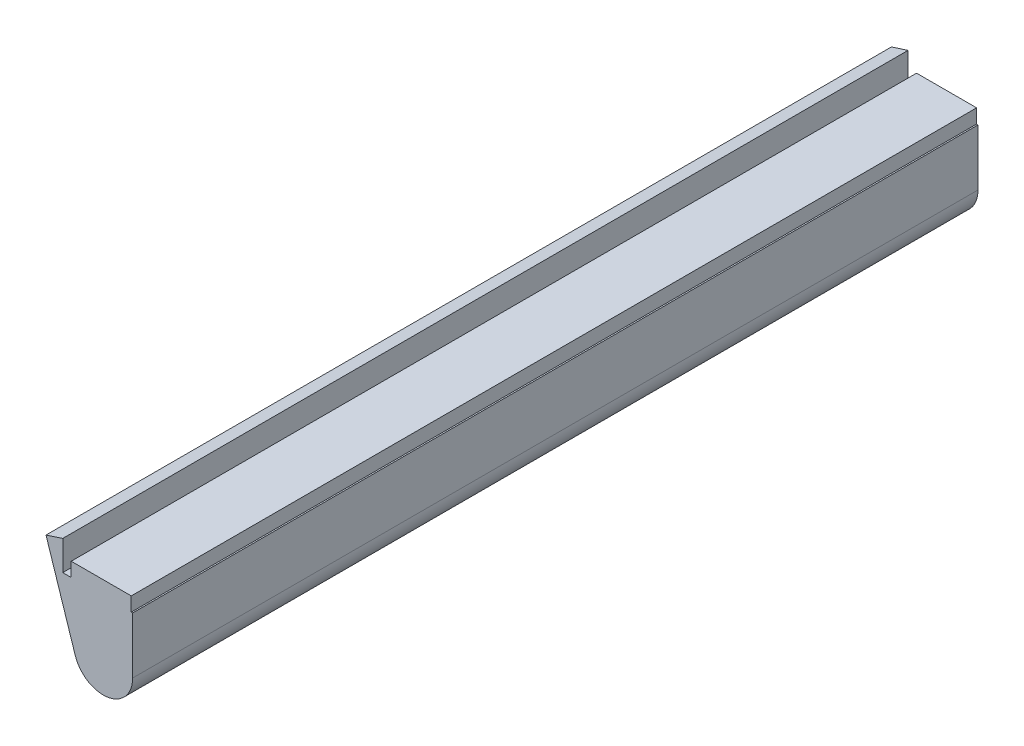
ISO-10303-21;
HEADER;
FILE_DESCRIPTION(('STEP AP214'),'2;1');
FILE_NAME('part.step','',(''),(''),'','','');
FILE_SCHEMA(('AUTOMOTIVE_DESIGN { 1 0 10303 214 1 1 1 1 }'));
ENDSEC;
DATA;
#1=APPLICATION_CONTEXT('core data for automotive mechanical design processes');
#2=APPLICATION_PROTOCOL_DEFINITION('international standard','automotive_design',2000,#1);
#3=PRODUCT_CONTEXT('',#1,'mechanical');
#4=PRODUCT('Part','Part','',(#3));
#5=PRODUCT_RELATED_PRODUCT_CATEGORY('part','',(#4));
#6=PRODUCT_DEFINITION_FORMATION('','',#4);
#7=PRODUCT_DEFINITION_CONTEXT('part definition',#1,'design');
#8=PRODUCT_DEFINITION('design','',#6,#7);
#9=PRODUCT_DEFINITION_SHAPE('','',#8);
#10=(LENGTH_UNIT() NAMED_UNIT(*) SI_UNIT(.MILLI.,.METRE.));
#11=(NAMED_UNIT(*) PLANE_ANGLE_UNIT() SI_UNIT($,.RADIAN.));
#12=(NAMED_UNIT(*) SI_UNIT($,.STERADIAN.) SOLID_ANGLE_UNIT());
#13=UNCERTAINTY_MEASURE_WITH_UNIT(LENGTH_MEASURE(1.E-05),#10,'distance_accuracy_value','');
#14=(GEOMETRIC_REPRESENTATION_CONTEXT(3) GLOBAL_UNCERTAINTY_ASSIGNED_CONTEXT((#13)) GLOBAL_UNIT_ASSIGNED_CONTEXT((#10,
#11,#12)) REPRESENTATION_CONTEXT('',''));
#15=CARTESIAN_POINT('',(0.,0.,0.));
#16=DIRECTION('',(0.,0.,1.));
#17=DIRECTION('',(1.,0.,0.));
#18=AXIS2_PLACEMENT_3D('',#15,#16,#17);
#19=CARTESIAN_POINT('',(-3.,0.,-300.));
#20=DIRECTION('',(-1.,0.,0.));
#21=DIRECTION('',(0.,-1.,0.));
#22=AXIS2_PLACEMENT_3D('',#19,#20,#21);
#23=PLANE('',#22);
#24=DIRECTION('',(0.,-1.,0.));
#25=VECTOR('',#24,1.);
#26=CARTESIAN_POINT('',(-3.,0.,0.));
#27=LINE('',#26,#25);
#28=CARTESIAN_POINT('',(-3.,0.518235133393875,0.));
#29=VERTEX_POINT('',#28);
#30=CARTESIAN_POINT('',(-3.,-9.99999999999999,0.));
#31=VERTEX_POINT('',#30);
#32=EDGE_CURVE('E143',#29,#31,#27,.T.);
#33=ORIENTED_EDGE('',*,*,#32,.T.);
#34=DIRECTION('',(0.,0.,1.));
#35=VECTOR('',#34,1.);
#36=CARTESIAN_POINT('',(-3.,-9.99999999999999,-300.));
#37=LINE('',#36,#35);
#38=CARTESIAN_POINT('',(-3.,-9.99999999999999,-300.));
#39=VERTEX_POINT('',#38);
#40=EDGE_CURVE('E11',#39,#31,#37,.T.);
#41=ORIENTED_EDGE('',*,*,#40,.F.);
#42=DIRECTION('',(0.,-1.,0.));
#43=VECTOR('',#42,1.);
#44=CARTESIAN_POINT('',(-3.,0.,-300.));
#45=LINE('',#44,#43);
#46=CARTESIAN_POINT('',(-3.,0.518235133393875,-300.));
#47=VERTEX_POINT('',#46);
#48=EDGE_CURVE('E53',#47,#39,#45,.T.);
#49=ORIENTED_EDGE('',*,*,#48,.F.);
#50=DIRECTION('',(0.,0.,1.));
#51=VECTOR('',#50,1.);
#52=CARTESIAN_POINT('',(-3.,0.518235133393875,-300.));
#53=LINE('',#52,#51);
#54=EDGE_CURVE('E38',#47,#29,#53,.T.);
#55=ORIENTED_EDGE('',*,*,#54,.T.);
#56=EDGE_LOOP('',(#33,#41,#49,#55));
#57=FACE_BOUND('',#56,.T.);
#58=ADVANCED_FACE('F35',(#57),#23,.F.);
#59=CARTESIAN_POINT('',(0.,-9.99999999999999,-300.));
#60=DIRECTION('',(0.,1.,0.));
#61=DIRECTION('',(0.,0.,1.));
#62=AXIS2_PLACEMENT_3D('',#59,#60,#61);
#63=PLANE('',#62);
#64=DIRECTION('',(-1.,0.,0.));
#65=VECTOR('',#64,1.);
#66=CARTESIAN_POINT('',(0.,-9.99999999999999,0.));
#67=LINE('',#66,#65);
#68=CARTESIAN_POINT('',(0.,-9.99999999999999,0.));
#69=VERTEX_POINT('',#68);
#70=EDGE_CURVE('E162',#69,#31,#67,.T.);
#71=ORIENTED_EDGE('',*,*,#70,.F.);
#72=DIRECTION('',(0.,0.,1.));
#73=VECTOR('',#72,1.);
#74=CARTESIAN_POINT('',(0.,-9.99999999999999,-300.));
#75=LINE('',#74,#73);
#76=CARTESIAN_POINT('',(0.,-9.99999999999999,-300.));
#77=VERTEX_POINT('',#76);
#78=EDGE_CURVE('E44',#77,#69,#75,.T.);
#79=ORIENTED_EDGE('',*,*,#78,.F.);
#80=DIRECTION('',(-1.,0.,0.));
#81=VECTOR('',#80,1.);
#82=CARTESIAN_POINT('',(0.,-9.99999999999999,-300.));
#83=LINE('',#82,#81);
#84=EDGE_CURVE('E123',#77,#39,#83,.T.);
#85=ORIENTED_EDGE('',*,*,#84,.T.);
#86=ORIENTED_EDGE('',*,*,#40,.T.);
#87=EDGE_LOOP('',(#71,#79,#85,#86));
#88=FACE_BOUND('',#87,.T.);
#89=ADVANCED_FACE('F186',(#88),#63,.T.);
#90=CARTESIAN_POINT('',(0.,0.,-300.));
#91=DIRECTION('',(1.,0.,0.));
#92=DIRECTION('',(0.,1.,0.));
#93=AXIS2_PLACEMENT_3D('',#90,#91,#92);
#94=PLANE('',#93);
#95=DIRECTION('',(0.,1.,0.));
#96=VECTOR('',#95,1.);
#97=CARTESIAN_POINT('',(0.,0.,0.));
#98=LINE('',#97,#96);
#99=CARTESIAN_POINT('',(0.,-4.99999999999999,0.));
#100=VERTEX_POINT('',#99);
#101=EDGE_CURVE('E128',#69,#100,#98,.T.);
#102=ORIENTED_EDGE('',*,*,#101,.T.);
#103=DIRECTION('',(0.,0.,1.));
#104=VECTOR('',#103,1.);
#105=CARTESIAN_POINT('',(0.,-4.99999999999999,-300.));
#106=LINE('',#105,#104);
#107=CARTESIAN_POINT('',(0.,-4.99999999999999,-300.));
#108=VERTEX_POINT('',#107);
#109=EDGE_CURVE('E126',#108,#100,#106,.T.);
#110=ORIENTED_EDGE('',*,*,#109,.F.);
#111=DIRECTION('',(0.,1.,0.));
#112=VECTOR('',#111,1.);
#113=CARTESIAN_POINT('',(0.,0.,-300.));
#114=LINE('',#113,#112);
#115=EDGE_CURVE('E117',#77,#108,#114,.T.);
#116=ORIENTED_EDGE('',*,*,#115,.F.);
#117=ORIENTED_EDGE('',*,*,#78,.T.);
#118=EDGE_LOOP('',(#102,#110,#116,#117));
#119=FACE_BOUND('',#118,.T.);
#120=ADVANCED_FACE('F127',(#119),#94,.F.);
#121=CARTESIAN_POINT('',(0.,-4.99999999999999,-300.));
#122=DIRECTION('',(0.,-1.,0.));
#123=DIRECTION('',(1.,0.,0.));
#124=AXIS2_PLACEMENT_3D('',#121,#122,#123);
#125=PLANE('',#124);
#126=DIRECTION('',(1.,0.,0.));
#127=VECTOR('',#126,1.);
#128=CARTESIAN_POINT('',(0.,-4.99999999999999,0.));
#129=LINE('',#128,#127);
#130=CARTESIAN_POINT('',(21.3000000000005,-5.,0.));
#131=VERTEX_POINT('',#130);
#132=EDGE_CURVE('E159',#100,#131,#129,.T.);
#133=ORIENTED_EDGE('',*,*,#132,.T.);
#134=DIRECTION('',(0.,0.,1.));
#135=VECTOR('',#134,1.);
#136=CARTESIAN_POINT('',(21.3000000000005,-5.,-300.));
#137=LINE('',#136,#135);
#138=CARTESIAN_POINT('',(21.3000000000005,-5.,-300.));
#139=VERTEX_POINT('',#138);
#140=EDGE_CURVE('E131',#139,#131,#137,.T.);
#141=ORIENTED_EDGE('',*,*,#140,.F.);
#142=DIRECTION('',(1.,0.,0.));
#143=VECTOR('',#142,1.);
#144=CARTESIAN_POINT('',(0.,-4.99999999999999,-300.));
#145=LINE('',#144,#143);
#146=EDGE_CURVE('E121',#108,#139,#145,.T.);
#147=ORIENTED_EDGE('',*,*,#146,.F.);
#148=ORIENTED_EDGE('',*,*,#109,.T.);
#149=EDGE_LOOP('',(#133,#141,#147,#148));
#150=FACE_BOUND('',#149,.T.);
#151=ADVANCED_FACE('F133',(#150),#125,.F.);
#152=CARTESIAN_POINT('',(21.3000000000005,0.,-300.));
#153=DIRECTION('',(-1.,0.,0.));
#154=DIRECTION('',(0.,-1.,0.));
#155=AXIS2_PLACEMENT_3D('',#152,#153,#154);
#156=PLANE('',#155);
#157=DIRECTION('',(0.,-1.,0.));
#158=VECTOR('',#157,1.);
#159=CARTESIAN_POINT('',(21.3000000000005,0.,0.));
#160=LINE('',#159,#158);
#161=CARTESIAN_POINT('',(21.3000000000005,-9.99999999999998,0.));
#162=VERTEX_POINT('',#161);
#163=EDGE_CURVE('E157',#131,#162,#160,.T.);
#164=ORIENTED_EDGE('',*,*,#163,.T.);
#165=DIRECTION('',(0.,0.,1.));
#166=VECTOR('',#165,1.);
#167=CARTESIAN_POINT('',(21.3000000000005,-9.99999999999998,-300.));
#168=LINE('',#167,#166);
#169=CARTESIAN_POINT('',(21.3000000000005,-9.99999999999998,-300.));
#170=VERTEX_POINT('',#169);
#171=EDGE_CURVE('E167',#170,#162,#168,.T.);
#172=ORIENTED_EDGE('',*,*,#171,.F.);
#173=DIRECTION('',(0.,-1.,0.));
#174=VECTOR('',#173,1.);
#175=CARTESIAN_POINT('',(21.3000000000005,0.,-300.));
#176=LINE('',#175,#174);
#177=EDGE_CURVE('E136',#139,#170,#176,.T.);
#178=ORIENTED_EDGE('',*,*,#177,.F.);
#179=ORIENTED_EDGE('',*,*,#140,.T.);
#180=EDGE_LOOP('',(#164,#172,#178,#179));
#181=FACE_BOUND('',#180,.T.);
#182=ADVANCED_FACE('F199',(#181),#156,.F.);
#183=CARTESIAN_POINT('',(-1.35308431126275E-12,-9.99999999999709,-300.));
#184=DIRECTION('',(-1.35308431126315E-13,-1.,0.));
#185=DIRECTION('',(1.,-1.35308431126315E-13,0.));
#186=AXIS2_PLACEMENT_3D('',#183,#184,#185);
#187=PLANE('',#186);
#188=DIRECTION('',(1.,-1.35308431126315E-13,0.));
#189=VECTOR('',#188,1.);
#190=CARTESIAN_POINT('',(-1.35308431126275E-12,-9.99999999999709,0.));
#191=LINE('',#190,#189);
#192=CARTESIAN_POINT('',(21.8,-10.,0.));
#193=VERTEX_POINT('',#192);
#194=EDGE_CURVE('E155',#162,#193,#191,.T.);
#195=ORIENTED_EDGE('',*,*,#194,.T.);
#196=DIRECTION('',(0.,0.,1.));
#197=VECTOR('',#196,1.);
#198=CARTESIAN_POINT('',(21.8,-10.,-300.));
#199=LINE('',#198,#197);
#200=CARTESIAN_POINT('',(21.8,-10.,-300.));
#201=VERTEX_POINT('',#200);
#202=EDGE_CURVE('E170',#201,#193,#199,.T.);
#203=ORIENTED_EDGE('',*,*,#202,.F.);
#204=DIRECTION('',(1.,-1.35308431126315E-13,0.));
#205=VECTOR('',#204,1.);
#206=CARTESIAN_POINT('',(-1.35308431126275E-12,-9.99999999999709,-300.));
#207=LINE('',#206,#205);
#208=EDGE_CURVE('E138',#170,#201,#207,.T.);
#209=ORIENTED_EDGE('',*,*,#208,.F.);
#210=ORIENTED_EDGE('',*,*,#171,.T.);
#211=EDGE_LOOP('',(#195,#203,#209,#210));
#212=FACE_BOUND('',#211,.T.);
#213=ADVANCED_FACE('F202',(#212),#187,.F.);
#214=CARTESIAN_POINT('',(21.8,0.,-300.));
#215=DIRECTION('',(-1.,0.,0.));
#216=DIRECTION('',(0.,-1.,0.));
#217=AXIS2_PLACEMENT_3D('',#214,#215,#216);
#218=PLANE('',#217);
#219=DIRECTION('',(0.,-1.,0.));
#220=VECTOR('',#219,1.);
#221=CARTESIAN_POINT('',(21.8,0.,0.));
#222=LINE('',#221,#220);
#223=CARTESIAN_POINT('',(21.8,-30.0000000000001,0.));
#224=VERTEX_POINT('',#223);
#225=EDGE_CURVE('E153',#193,#224,#222,.T.);
#226=ORIENTED_EDGE('',*,*,#225,.T.);
#227=DIRECTION('',(0.,0.,1.));
#228=VECTOR('',#227,1.);
#229=CARTESIAN_POINT('',(21.8,-30.0000000000001,-300.));
#230=LINE('',#229,#228);
#231=CARTESIAN_POINT('',(21.8,-30.0000000000001,-300.));
#232=VERTEX_POINT('',#231);
#233=EDGE_CURVE('E173',#232,#224,#230,.T.);
#234=ORIENTED_EDGE('',*,*,#233,.F.);
#235=DIRECTION('',(0.,-1.,0.));
#236=VECTOR('',#235,1.);
#237=CARTESIAN_POINT('',(21.8,0.,-300.));
#238=LINE('',#237,#236);
#239=EDGE_CURVE('E346',#201,#232,#238,.T.);
#240=ORIENTED_EDGE('',*,*,#239,.F.);
#241=ORIENTED_EDGE('',*,*,#202,.T.);
#242=EDGE_LOOP('',(#226,#234,#240,#241));
#243=FACE_BOUND('',#242,.T.);
#244=ADVANCED_FACE('F206',(#243),#218,.F.);
#245=CARTESIAN_POINT('',(11.353813342016,-30.,-300.));
#246=DIRECTION('',(0.,0.,1.));
#247=DIRECTION('',(1.,0.,0.));
#248=AXIS2_PLACEMENT_3D('',#245,#246,#247);
#249=CYLINDRICAL_SURFACE('',#248,10.446186657984);
#250=CARTESIAN_POINT('',(11.353813342016,-30.,0.));
#251=DIRECTION('',(0.,0.,1.));
#252=DIRECTION('',(1.,0.,0.));
#253=AXIS2_PLACEMENT_3D('',#250,#251,#252);
#254=CIRCLE('',#253,10.446186657984);
#255=CARTESIAN_POINT('',(1.42231197747726,-33.238533053654,0.));
#256=VERTEX_POINT('',#255);
#257=EDGE_CURVE('E150',#224,#256,#254,.F.);
#258=ORIENTED_EDGE('',*,*,#257,.T.);
#259=DIRECTION('',(0.,0.,1.));
#260=VECTOR('',#259,1.);
#261=CARTESIAN_POINT('',(1.42231197747726,-33.238533053654,-300.));
#262=LINE('',#261,#260);
#263=CARTESIAN_POINT('',(1.42231197747726,-33.238533053654,-300.));
#264=VERTEX_POINT('',#263);
#265=EDGE_CURVE('E176',#264,#256,#262,.T.);
#266=ORIENTED_EDGE('',*,*,#265,.F.);
#267=CARTESIAN_POINT('',(11.353813342016,-30.,-300.));
#268=DIRECTION('',(0.,0.,1.));
#269=DIRECTION('',(1.,0.,0.));
#270=AXIS2_PLACEMENT_3D('',#267,#268,#269);
#271=CIRCLE('',#270,10.446186657984);
#272=EDGE_CURVE('E344',#232,#264,#271,.F.);
#273=ORIENTED_EDGE('',*,*,#272,.F.);
#274=ORIENTED_EDGE('',*,*,#233,.T.);
#275=EDGE_LOOP('',(#258,#266,#273,#274));
#276=FACE_BOUND('',#275,.T.);
#277=ADVANCED_FACE('F210',(#276),#249,.T.);
#278=CARTESIAN_POINT('',(-8.51130955261827,-2.7754270280277,-300.));
#279=DIRECTION('',(-0.950729839481479,-0.310020599830917,0.));
#280=DIRECTION('',(0.310020599830917,-0.950729839481479,0.));
#281=AXIS2_PLACEMENT_3D('',#278,#279,#280);
#282=PLANE('',#281);
#283=DIRECTION('',(0.310020599830917,-0.950729839481479,0.));
#284=VECTOR('',#283,1.);
#285=CARTESIAN_POINT('',(-8.51130955261827,-2.7754270280277,0.));
#286=LINE('',#285,#284);
#287=CARTESIAN_POINT('',(-8.95239551675401,-1.42276340467809,0.));
#288=VERTEX_POINT('',#287);
#289=EDGE_CURVE('E147',#288,#256,#286,.T.);
#290=ORIENTED_EDGE('',*,*,#289,.F.);
#291=DIRECTION('',(0.,0.,1.));
#292=VECTOR('',#291,1.);
#293=CARTESIAN_POINT('',(-8.95239551675401,-1.42276340467809,-300.));
#294=LINE('',#293,#292);
#295=CARTESIAN_POINT('',(-8.95239551675401,-1.42276340467809,-300.));
#296=VERTEX_POINT('',#295);
#297=EDGE_CURVE('E177',#296,#288,#294,.T.);
#298=ORIENTED_EDGE('',*,*,#297,.F.);
#299=DIRECTION('',(0.310020599830917,-0.950729839481479,0.));
#300=VECTOR('',#299,1.);
#301=CARTESIAN_POINT('',(-8.51130955261827,-2.7754270280277,-300.));
#302=LINE('',#301,#300);
#303=EDGE_CURVE('E354',#296,#264,#302,.T.);
#304=ORIENTED_EDGE('',*,*,#303,.T.);
#305=ORIENTED_EDGE('',*,*,#265,.T.);
#306=EDGE_LOOP('',(#290,#298,#304,#305));
#307=FACE_BOUND('',#306,.T.);
#308=ADVANCED_FACE('F214',(#307),#282,.T.);
#309=CARTESIAN_POINT('',(-0.441085964135744,1.35266362334961,-300.));
#310=DIRECTION('',(0.310020599830918,-0.950729839481479,0.));
#311=DIRECTION('',(0.950729839481479,0.310020599830918,0.));
#312=AXIS2_PLACEMENT_3D('',#309,#310,#311);
#313=PLANE('',#312);
#314=DIRECTION('',(0.950729839481479,0.310020599830918,0.));
#315=VECTOR('',#314,1.);
#316=CARTESIAN_POINT('',(-0.441085964135744,1.35266362334961,0.));
#317=LINE('',#316,#315);
#318=EDGE_CURVE('E145',#288,#29,#317,.T.);
#319=ORIENTED_EDGE('',*,*,#318,.T.);
#320=ORIENTED_EDGE('',*,*,#54,.F.);
#321=DIRECTION('',(0.950729839481479,0.310020599830918,0.));
#322=VECTOR('',#321,1.);
#323=CARTESIAN_POINT('',(-0.441085964135744,1.35266362334961,-300.));
#324=LINE('',#323,#322);
#325=EDGE_CURVE('E97',#296,#47,#324,.T.);
#326=ORIENTED_EDGE('',*,*,#325,.F.);
#327=ORIENTED_EDGE('',*,*,#297,.T.);
#328=EDGE_LOOP('',(#319,#320,#326,#327));
#329=FACE_BOUND('',#328,.T.);
#330=ADVANCED_FACE('F217',(#329),#313,.F.);
#331=CARTESIAN_POINT('',(0.,0.,-300.));
#332=DIRECTION('',(0.,0.,1.));
#333=DIRECTION('',(1.,0.,0.));
#334=AXIS2_PLACEMENT_3D('',#331,#332,#333);
#335=PLANE('',#334);
#336=ORIENTED_EDGE('',*,*,#48,.T.);
#337=ORIENTED_EDGE('',*,*,#84,.F.);
#338=ORIENTED_EDGE('',*,*,#115,.T.);
#339=ORIENTED_EDGE('',*,*,#146,.T.);
#340=ORIENTED_EDGE('',*,*,#177,.T.);
#341=ORIENTED_EDGE('',*,*,#208,.T.);
#342=ORIENTED_EDGE('',*,*,#239,.T.);
#343=ORIENTED_EDGE('',*,*,#272,.T.);
#344=ORIENTED_EDGE('',*,*,#303,.F.);
#345=ORIENTED_EDGE('',*,*,#325,.T.);
#346=EDGE_LOOP('',(#336,#337,#338,#339,#340,#341,#342,#343,#344,#345));
#347=FACE_BOUND('',#346,.T.);
#348=ADVANCED_FACE('F119',(#347),#335,.F.);
#349=CARTESIAN_POINT('',(0.,0.,0.));
#350=DIRECTION('',(0.,0.,1.));
#351=DIRECTION('',(1.,0.,0.));
#352=AXIS2_PLACEMENT_3D('',#349,#350,#351);
#353=PLANE('',#352);
#354=ORIENTED_EDGE('',*,*,#32,.F.);
#355=ORIENTED_EDGE('',*,*,#318,.F.);
#356=ORIENTED_EDGE('',*,*,#289,.T.);
#357=ORIENTED_EDGE('',*,*,#257,.F.);
#358=ORIENTED_EDGE('',*,*,#225,.F.);
#359=ORIENTED_EDGE('',*,*,#194,.F.);
#360=ORIENTED_EDGE('',*,*,#163,.F.);
#361=ORIENTED_EDGE('',*,*,#132,.F.);
#362=ORIENTED_EDGE('',*,*,#101,.F.);
#363=ORIENTED_EDGE('',*,*,#70,.T.);
#364=EDGE_LOOP('',(#354,#355,#356,#357,#358,#359,#360,#361,#362,#363));
#365=FACE_BOUND('',#364,.T.);
#366=ADVANCED_FACE('F184',(#365),#353,.T.);
#367=CLOSED_SHELL('',(#58,#89,#120,#151,#182,#213,#244,#277,#308,#330,#348,#366));
#368=MANIFOLD_SOLID_BREP('B2',#367);
#369=ADVANCED_BREP_SHAPE_REPRESENTATION('',(#18,#368),#14);
#370=SHAPE_DEFINITION_REPRESENTATION(#9,#369);
ENDSEC;
END-ISO-10303-21;
